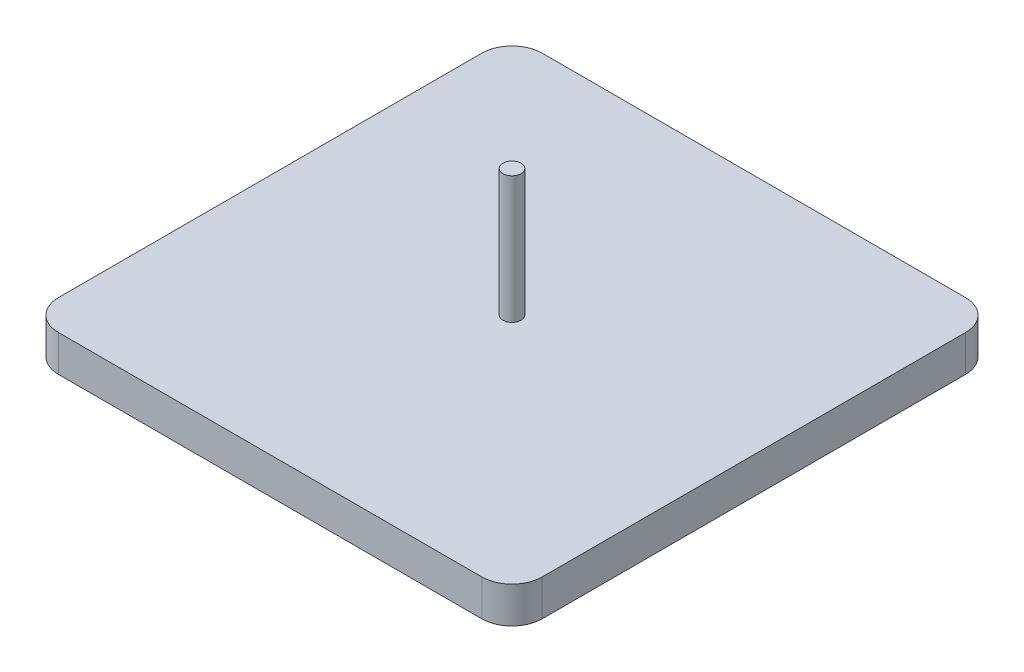
ISO-10303-21;
HEADER;
FILE_DESCRIPTION(('STEP AP214'),'2;1');
FILE_NAME('part.step','',(''),(''),'','','');
FILE_SCHEMA(('AUTOMOTIVE_DESIGN { 1 0 10303 214 1 1 1 1 }'));
ENDSEC;
DATA;
#1=APPLICATION_CONTEXT('core data for automotive mechanical design processes');
#2=APPLICATION_PROTOCOL_DEFINITION('international standard','automotive_design',2000,#1);
#3=PRODUCT_CONTEXT('',#1,'mechanical');
#4=PRODUCT('Part','Part','',(#3));
#5=PRODUCT_RELATED_PRODUCT_CATEGORY('part','',(#4));
#6=PRODUCT_DEFINITION_FORMATION('','',#4);
#7=PRODUCT_DEFINITION_CONTEXT('part definition',#1,'design');
#8=PRODUCT_DEFINITION('design','',#6,#7);
#9=PRODUCT_DEFINITION_SHAPE('','',#8);
#10=(LENGTH_UNIT() NAMED_UNIT(*) SI_UNIT(.MILLI.,.METRE.));
#11=(NAMED_UNIT(*) PLANE_ANGLE_UNIT() SI_UNIT($,.RADIAN.));
#12=(NAMED_UNIT(*) SI_UNIT($,.STERADIAN.) SOLID_ANGLE_UNIT());
#13=UNCERTAINTY_MEASURE_WITH_UNIT(LENGTH_MEASURE(1.E-05),#10,'distance_accuracy_value','');
#14=(GEOMETRIC_REPRESENTATION_CONTEXT(3) GLOBAL_UNCERTAINTY_ASSIGNED_CONTEXT((#13)) GLOBAL_UNIT_ASSIGNED_CONTEXT((#10,
#11,#12)) REPRESENTATION_CONTEXT('',''));
#15=CARTESIAN_POINT('',(0.,0.,0.));
#16=DIRECTION('',(0.,0.,1.));
#17=DIRECTION('',(1.,0.,0.));
#18=AXIS2_PLACEMENT_3D('',#15,#16,#17);
#19=CARTESIAN_POINT('',(-21.4242159213805,6.,-53.9848806668951));
#20=DIRECTION('',(1.,0.,0.));
#21=DIRECTION('',(0.,0.,-1.));
#22=AXIS2_PLACEMENT_3D('',#19,#20,#21);
#23=PLANE('',#22);
#24=DIRECTION('',(0.,0.,1.));
#25=VECTOR('',#24,1.);
#26=CARTESIAN_POINT('',(-21.4242159213805,6.,-53.9848806668951));
#27=LINE('',#26,#25);
#28=CARTESIAN_POINT('',(-21.4242159213805,6.,-48.9848806668951));
#29=VERTEX_POINT('',#28);
#30=CARTESIAN_POINT('',(-21.4242159213805,6.,21.0151193331049));
#31=VERTEX_POINT('',#30);
#32=EDGE_CURVE('E132',#29,#31,#27,.T.);
#33=ORIENTED_EDGE('',*,*,#32,.F.);
#34=DIRECTION('',(0.,-1.,0.));
#35=VECTOR('',#34,1.);
#36=CARTESIAN_POINT('',(-21.4242159213805,6.,-48.9848806668951));
#37=LINE('',#36,#35);
#38=CARTESIAN_POINT('',(-21.4242159213805,0.,-48.9848806668951));
#39=VERTEX_POINT('',#38);
#40=EDGE_CURVE('E116',#29,#39,#37,.T.);
#41=ORIENTED_EDGE('',*,*,#40,.T.);
#42=DIRECTION('',(0.,0.,1.));
#43=VECTOR('',#42,1.);
#44=CARTESIAN_POINT('',(-21.4242159213805,0.,-53.9848806668951));
#45=LINE('',#44,#43);
#46=CARTESIAN_POINT('',(-21.4242159213805,0.,21.0151193331049));
#47=VERTEX_POINT('',#46);
#48=EDGE_CURVE('E129',#39,#47,#45,.T.);
#49=ORIENTED_EDGE('',*,*,#48,.T.);
#50=DIRECTION('',(0.,-1.,0.));
#51=VECTOR('',#50,1.);
#52=CARTESIAN_POINT('',(-21.4242159213805,6.,21.0151193331049));
#53=LINE('',#52,#51);
#54=EDGE_CURVE('E135',#47,#31,#53,.F.);
#55=ORIENTED_EDGE('',*,*,#54,.T.);
#56=EDGE_LOOP('',(#33,#41,#49,#55));
#57=FACE_BOUND('',#56,.T.);
#58=ADVANCED_FACE('F43',(#57),#23,.F.);
#59=CARTESIAN_POINT('',(-21.4242159213805,6.,26.0151193331049));
#60=DIRECTION('',(0.,0.,-1.));
#61=DIRECTION('',(-1.,0.,0.));
#62=AXIS2_PLACEMENT_3D('',#59,#60,#61);
#63=PLANE('',#62);
#64=DIRECTION('',(1.,0.,0.));
#65=VECTOR('',#64,1.);
#66=CARTESIAN_POINT('',(-21.4242159213805,6.,26.0151193331049));
#67=LINE('',#66,#65);
#68=CARTESIAN_POINT('',(-16.4242159213805,6.,26.0151193331049));
#69=VERTEX_POINT('',#68);
#70=CARTESIAN_POINT('',(53.5757840786195,6.,26.0151193331049));
#71=VERTEX_POINT('',#70);
#72=EDGE_CURVE('E194',#69,#71,#67,.T.);
#73=ORIENTED_EDGE('',*,*,#72,.F.);
#74=DIRECTION('',(0.,-1.,0.));
#75=VECTOR('',#74,1.);
#76=CARTESIAN_POINT('',(-16.4242159213805,6.,26.0151193331049));
#77=LINE('',#76,#75);
#78=CARTESIAN_POINT('',(-16.4242159213805,0.,26.0151193331049));
#79=VERTEX_POINT('',#78);
#80=EDGE_CURVE('E11',#69,#79,#77,.T.);
#81=ORIENTED_EDGE('',*,*,#80,.T.);
#82=DIRECTION('',(1.,0.,0.));
#83=VECTOR('',#82,1.);
#84=CARTESIAN_POINT('',(-21.4242159213805,0.,26.0151193331049));
#85=LINE('',#84,#83);
#86=CARTESIAN_POINT('',(53.5757840786195,0.,26.0151193331049));
#87=VERTEX_POINT('',#86);
#88=EDGE_CURVE('E141',#79,#87,#85,.T.);
#89=ORIENTED_EDGE('',*,*,#88,.T.);
#90=DIRECTION('',(0.,-1.,0.));
#91=VECTOR('',#90,1.);
#92=CARTESIAN_POINT('',(53.5757840786195,6.,26.0151193331049));
#93=LINE('',#92,#91);
#94=EDGE_CURVE('E53',#87,#71,#93,.F.);
#95=ORIENTED_EDGE('',*,*,#94,.T.);
#96=EDGE_LOOP('',(#73,#81,#89,#95));
#97=FACE_BOUND('',#96,.T.);
#98=ADVANCED_FACE('F193',(#97),#63,.F.);
#99=CARTESIAN_POINT('',(58.5757840786195,6.,-53.9848806668951));
#100=DIRECTION('',(-1.,0.,0.));
#101=DIRECTION('',(0.,0.,1.));
#102=AXIS2_PLACEMENT_3D('',#99,#100,#101);
#103=PLANE('',#102);
#104=DIRECTION('',(0.,0.,-1.));
#105=VECTOR('',#104,1.);
#106=CARTESIAN_POINT('',(58.5757840786195,0.,-53.9848806668951));
#107=LINE('',#106,#105);
#108=CARTESIAN_POINT('',(58.5757840786195,0.,21.0151193331049));
#109=VERTEX_POINT('',#108);
#110=CARTESIAN_POINT('',(58.5757840786195,0.,-48.9848806668951));
#111=VERTEX_POINT('',#110);
#112=EDGE_CURVE('E146',#109,#111,#107,.T.);
#113=ORIENTED_EDGE('',*,*,#112,.T.);
#114=DIRECTION('',(0.,-1.,0.));
#115=VECTOR('',#114,1.);
#116=CARTESIAN_POINT('',(58.5757840786195,6.,-48.9848806668951));
#117=LINE('',#116,#115);
#118=CARTESIAN_POINT('',(58.5757840786195,6.,-48.9848806668951));
#119=VERTEX_POINT('',#118);
#120=EDGE_CURVE('E60',#111,#119,#117,.F.);
#121=ORIENTED_EDGE('',*,*,#120,.T.);
#122=DIRECTION('',(0.,0.,-1.));
#123=VECTOR('',#122,1.);
#124=CARTESIAN_POINT('',(58.5757840786195,6.,-53.9848806668951));
#125=LINE('',#124,#123);
#126=CARTESIAN_POINT('',(58.5757840786195,6.,21.0151193331049));
#127=VERTEX_POINT('',#126);
#128=EDGE_CURVE('E201',#127,#119,#125,.T.);
#129=ORIENTED_EDGE('',*,*,#128,.F.);
#130=DIRECTION('',(0.,-1.,0.));
#131=VECTOR('',#130,1.);
#132=CARTESIAN_POINT('',(58.5757840786195,6.,21.0151193331049));
#133=LINE('',#132,#131);
#134=EDGE_CURVE('E183',#127,#109,#133,.T.);
#135=ORIENTED_EDGE('',*,*,#134,.T.);
#136=EDGE_LOOP('',(#113,#121,#129,#135));
#137=FACE_BOUND('',#136,.T.);
#138=ADVANCED_FACE('F205',(#137),#103,.F.);
#139=CARTESIAN_POINT('',(-21.4242159213805,6.,-53.9848806668951));
#140=DIRECTION('',(0.,0.,1.));
#141=DIRECTION('',(1.,0.,0.));
#142=AXIS2_PLACEMENT_3D('',#139,#140,#141);
#143=PLANE('',#142);
#144=DIRECTION('',(-1.,0.,0.));
#145=VECTOR('',#144,1.);
#146=CARTESIAN_POINT('',(-21.4242159213805,0.,-53.9848806668951));
#147=LINE('',#146,#145);
#148=CARTESIAN_POINT('',(53.5757840786195,0.,-53.9848806668951));
#149=VERTEX_POINT('',#148);
#150=CARTESIAN_POINT('',(-16.4242159213805,0.,-53.9848806668951));
#151=VERTEX_POINT('',#150);
#152=EDGE_CURVE('E156',#149,#151,#147,.T.);
#153=ORIENTED_EDGE('',*,*,#152,.T.);
#154=DIRECTION('',(0.,-1.,0.));
#155=VECTOR('',#154,1.);
#156=CARTESIAN_POINT('',(-16.4242159213805,6.,-53.9848806668951));
#157=LINE('',#156,#155);
#158=CARTESIAN_POINT('',(-16.4242159213805,6.,-53.9848806668951));
#159=VERTEX_POINT('',#158);
#160=EDGE_CURVE('E117',#151,#159,#157,.F.);
#161=ORIENTED_EDGE('',*,*,#160,.T.);
#162=DIRECTION('',(-1.,0.,0.));
#163=VECTOR('',#162,1.);
#164=CARTESIAN_POINT('',(-21.4242159213805,6.,-53.9848806668951));
#165=LINE('',#164,#163);
#166=CARTESIAN_POINT('',(53.5757840786195,6.,-53.9848806668951));
#167=VERTEX_POINT('',#166);
#168=EDGE_CURVE('E151',#167,#159,#165,.T.);
#169=ORIENTED_EDGE('',*,*,#168,.F.);
#170=DIRECTION('',(0.,-1.,0.));
#171=VECTOR('',#170,1.);
#172=CARTESIAN_POINT('',(53.5757840786195,6.,-53.9848806668951));
#173=LINE('',#172,#171);
#174=EDGE_CURVE('E123',#167,#149,#173,.T.);
#175=ORIENTED_EDGE('',*,*,#174,.T.);
#176=EDGE_LOOP('',(#153,#161,#169,#175));
#177=FACE_BOUND('',#176,.T.);
#178=ADVANCED_FACE('F212',(#177),#143,.F.);
#179=CARTESIAN_POINT('',(0.,6.,0.));
#180=DIRECTION('',(0.,1.,0.));
#181=DIRECTION('',(0.,0.,1.));
#182=AXIS2_PLACEMENT_3D('',#179,#180,#181);
#183=PLANE('',#182);
#184=CARTESIAN_POINT('',(18.5757840786195,6.,-13.9848806668951));
#185=DIRECTION('',(0.,1.,0.));
#186=DIRECTION('',(0.,0.,1.));
#187=AXIS2_PLACEMENT_3D('',#184,#185,#186);
#188=CIRCLE('',#187,1.5);
#189=CARTESIAN_POINT('',(18.5757840786195,6.,-12.4848806668951));
#190=VERTEX_POINT('',#189);
#191=EDGE_CURVE('E47',#190,#190,#188,.F.);
#192=ORIENTED_EDGE('',*,*,#191,.T.);
#193=EDGE_LOOP('',(#192));
#194=FACE_BOUND('',#193,.T.);
#195=ORIENTED_EDGE('',*,*,#168,.T.);
#196=CARTESIAN_POINT('',(-16.4242159213805,6.,-48.9848806668951));
#197=DIRECTION('',(0.,1.,0.));
#198=DIRECTION('',(0.,0.,1.));
#199=AXIS2_PLACEMENT_3D('',#196,#197,#198);
#200=CIRCLE('',#199,5.);
#201=EDGE_CURVE('E180',#159,#29,#200,.T.);
#202=ORIENTED_EDGE('',*,*,#201,.T.);
#203=ORIENTED_EDGE('',*,*,#32,.T.);
#204=CARTESIAN_POINT('',(-16.4242159213805,6.,21.0151193331049));
#205=DIRECTION('',(0.,1.,0.));
#206=DIRECTION('',(0.,0.,1.));
#207=AXIS2_PLACEMENT_3D('',#204,#205,#206);
#208=CIRCLE('',#207,5.);
#209=EDGE_CURVE('E174',#31,#69,#208,.T.);
#210=ORIENTED_EDGE('',*,*,#209,.T.);
#211=ORIENTED_EDGE('',*,*,#72,.T.);
#212=CARTESIAN_POINT('',(53.5757840786195,6.,21.0151193331049));
#213=DIRECTION('',(0.,1.,0.));
#214=DIRECTION('',(0.,0.,1.));
#215=AXIS2_PLACEMENT_3D('',#212,#213,#214);
#216=CIRCLE('',#215,5.);
#217=EDGE_CURVE('E67',#71,#127,#216,.T.);
#218=ORIENTED_EDGE('',*,*,#217,.T.);
#219=ORIENTED_EDGE('',*,*,#128,.T.);
#220=CARTESIAN_POINT('',(53.5757840786195,6.,-48.9848806668951));
#221=DIRECTION('',(0.,1.,0.));
#222=DIRECTION('',(0.,0.,1.));
#223=AXIS2_PLACEMENT_3D('',#220,#221,#222);
#224=CIRCLE('',#223,5.);
#225=EDGE_CURVE('E177',#119,#167,#224,.T.);
#226=ORIENTED_EDGE('',*,*,#225,.T.);
#227=EDGE_LOOP('',(#195,#202,#203,#210,#211,#218,#219,#226));
#228=FACE_BOUND('',#227,.T.);
#229=ADVANCED_FACE('F198',(#194,#228),#183,.T.);
#230=CARTESIAN_POINT('',(0.,0.,0.));
#231=DIRECTION('',(0.,1.,0.));
#232=DIRECTION('',(0.,0.,1.));
#233=AXIS2_PLACEMENT_3D('',#230,#231,#232);
#234=PLANE('',#233);
#235=ORIENTED_EDGE('',*,*,#48,.F.);
#236=CARTESIAN_POINT('',(-16.4242159213805,0.,-48.9848806668951));
#237=DIRECTION('',(0.,1.,0.));
#238=DIRECTION('',(0.,0.,1.));
#239=AXIS2_PLACEMENT_3D('',#236,#237,#238);
#240=CIRCLE('',#239,5.);
#241=EDGE_CURVE('E112',#39,#151,#240,.F.);
#242=ORIENTED_EDGE('',*,*,#241,.T.);
#243=ORIENTED_EDGE('',*,*,#152,.F.);
#244=CARTESIAN_POINT('',(53.5757840786195,0.,-48.9848806668951));
#245=DIRECTION('',(0.,1.,0.));
#246=DIRECTION('',(0.,0.,1.));
#247=AXIS2_PLACEMENT_3D('',#244,#245,#246);
#248=CIRCLE('',#247,5.);
#249=EDGE_CURVE('E124',#149,#111,#248,.F.);
#250=ORIENTED_EDGE('',*,*,#249,.T.);
#251=ORIENTED_EDGE('',*,*,#112,.F.);
#252=CARTESIAN_POINT('',(53.5757840786195,0.,21.0151193331049));
#253=DIRECTION('',(0.,1.,0.));
#254=DIRECTION('',(0.,0.,1.));
#255=AXIS2_PLACEMENT_3D('',#252,#253,#254);
#256=CIRCLE('',#255,5.);
#257=EDGE_CURVE('E134',#109,#87,#256,.F.);
#258=ORIENTED_EDGE('',*,*,#257,.T.);
#259=ORIENTED_EDGE('',*,*,#88,.F.);
#260=CARTESIAN_POINT('',(-16.4242159213805,0.,21.0151193331049));
#261=DIRECTION('',(0.,1.,0.));
#262=DIRECTION('',(0.,0.,1.));
#263=AXIS2_PLACEMENT_3D('',#260,#261,#262);
#264=CIRCLE('',#263,5.);
#265=EDGE_CURVE('E139',#79,#47,#264,.F.);
#266=ORIENTED_EDGE('',*,*,#265,.T.);
#267=EDGE_LOOP('',(#235,#242,#243,#250,#251,#258,#259,#266));
#268=FACE_BOUND('',#267,.T.);
#269=ADVANCED_FACE('F137',(#268),#234,.F.);
#270=CARTESIAN_POINT('',(-16.4242159213805,6.,-48.9848806668951));
#271=DIRECTION('',(0.,-1.,0.));
#272=DIRECTION('',(0.,0.,-1.));
#273=AXIS2_PLACEMENT_3D('',#270,#271,#272);
#274=CYLINDRICAL_SURFACE('',#273,5.);
#275=ORIENTED_EDGE('',*,*,#201,.F.);
#276=ORIENTED_EDGE('',*,*,#160,.F.);
#277=ORIENTED_EDGE('',*,*,#241,.F.);
#278=ORIENTED_EDGE('',*,*,#40,.F.);
#279=EDGE_LOOP('',(#275,#276,#277,#278));
#280=FACE_BOUND('',#279,.T.);
#281=ADVANCED_FACE('F115',(#280),#274,.T.);
#282=CARTESIAN_POINT('',(53.5757840786195,6.,-48.9848806668951));
#283=DIRECTION('',(0.,-1.,0.));
#284=DIRECTION('',(0.,0.,-1.));
#285=AXIS2_PLACEMENT_3D('',#282,#283,#284);
#286=CYLINDRICAL_SURFACE('',#285,5.);
#287=ORIENTED_EDGE('',*,*,#225,.F.);
#288=ORIENTED_EDGE('',*,*,#120,.F.);
#289=ORIENTED_EDGE('',*,*,#249,.F.);
#290=ORIENTED_EDGE('',*,*,#174,.F.);
#291=EDGE_LOOP('',(#287,#288,#289,#290));
#292=FACE_BOUND('',#291,.T.);
#293=ADVANCED_FACE('F209',(#292),#286,.T.);
#294=CARTESIAN_POINT('',(-16.4242159213805,6.,21.0151193331049));
#295=DIRECTION('',(0.,-1.,0.));
#296=DIRECTION('',(0.,0.,-1.));
#297=AXIS2_PLACEMENT_3D('',#294,#295,#296);
#298=CYLINDRICAL_SURFACE('',#297,5.);
#299=ORIENTED_EDGE('',*,*,#209,.F.);
#300=ORIENTED_EDGE('',*,*,#54,.F.);
#301=ORIENTED_EDGE('',*,*,#265,.F.);
#302=ORIENTED_EDGE('',*,*,#80,.F.);
#303=EDGE_LOOP('',(#299,#300,#301,#302));
#304=FACE_BOUND('',#303,.T.);
#305=ADVANCED_FACE('F233',(#304),#298,.T.);
#306=CARTESIAN_POINT('',(53.5757840786195,6.,21.0151193331049));
#307=DIRECTION('',(0.,-1.,0.));
#308=DIRECTION('',(0.,0.,-1.));
#309=AXIS2_PLACEMENT_3D('',#306,#307,#308);
#310=CYLINDRICAL_SURFACE('',#309,5.);
#311=ORIENTED_EDGE('',*,*,#217,.F.);
#312=ORIENTED_EDGE('',*,*,#94,.F.);
#313=ORIENTED_EDGE('',*,*,#257,.F.);
#314=ORIENTED_EDGE('',*,*,#134,.F.);
#315=EDGE_LOOP('',(#311,#312,#313,#314));
#316=FACE_BOUND('',#315,.T.);
#317=ADVANCED_FACE('F45',(#316),#310,.T.);
#318=CARTESIAN_POINT('',(18.5757840786195,27.,-13.9848806668951));
#319=DIRECTION('',(0.,-1.,0.));
#320=DIRECTION('',(0.,0.,-1.));
#321=AXIS2_PLACEMENT_3D('',#318,#319,#320);
#322=CYLINDRICAL_SURFACE('',#321,1.5);
#323=ORIENTED_EDGE('',*,*,#191,.F.);
#324=EDGE_LOOP('',(#323));
#325=FACE_BOUND('',#324,.T.);
#326=CARTESIAN_POINT('',(18.5757840786195,27.,-13.9848806668951));
#327=DIRECTION('',(0.,1.,0.));
#328=DIRECTION('',(0.,0.,1.));
#329=AXIS2_PLACEMENT_3D('',#326,#327,#328);
#330=CIRCLE('',#329,1.5);
#331=CARTESIAN_POINT('',(18.5757840786195,27.,-12.4848806668951));
#332=VERTEX_POINT('',#331);
#333=EDGE_CURVE('E149',#332,#332,#330,.T.);
#334=ORIENTED_EDGE('',*,*,#333,.F.);
#335=EDGE_LOOP('',(#334));
#336=FACE_BOUND('',#335,.T.);
#337=ADVANCED_FACE('F224',(#325,#336),#322,.T.);
#338=CARTESIAN_POINT('',(0.,27.,0.));
#339=DIRECTION('',(0.,1.,0.));
#340=DIRECTION('',(0.,0.,1.));
#341=AXIS2_PLACEMENT_3D('',#338,#339,#340);
#342=PLANE('',#341);
#343=ORIENTED_EDGE('',*,*,#333,.T.);
#344=EDGE_LOOP('',(#343));
#345=FACE_BOUND('',#344,.T.);
#346=ADVANCED_FACE('F222',(#345),#342,.T.);
#347=CLOSED_SHELL('',(#58,#98,#138,#178,#229,#269,#281,#293,#305,#317,#337,#346));
#348=MANIFOLD_SOLID_BREP('B2',#347);
#349=ADVANCED_BREP_SHAPE_REPRESENTATION('',(#18,#348),#14);
#350=SHAPE_DEFINITION_REPRESENTATION(#9,#349);
ENDSEC;
END-ISO-10303-21;
